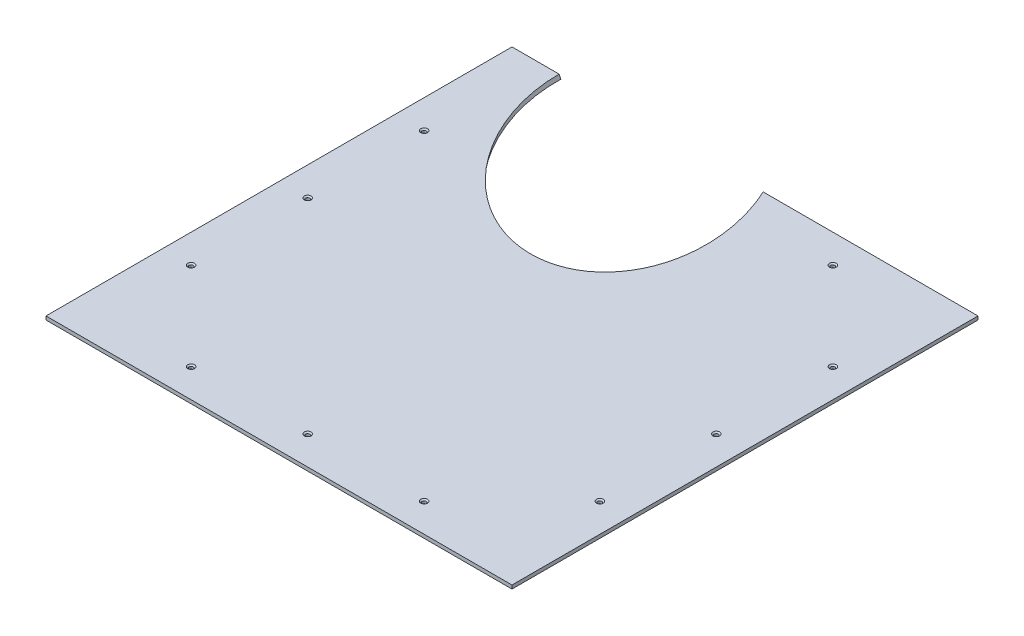
ISO-10303-21;
HEADER;
FILE_DESCRIPTION(('STEP AP214'),'2;1');
FILE_NAME('part.step','',(''),(''),'','','');
FILE_SCHEMA(('AUTOMOTIVE_DESIGN { 1 0 10303 214 1 1 1 1 }'));
ENDSEC;
DATA;
#1=APPLICATION_CONTEXT('core data for automotive mechanical design processes');
#2=APPLICATION_PROTOCOL_DEFINITION('international standard','automotive_design',2000,#1);
#3=PRODUCT_CONTEXT('',#1,'mechanical');
#4=PRODUCT('Part','Part','',(#3));
#5=PRODUCT_RELATED_PRODUCT_CATEGORY('part','',(#4));
#6=PRODUCT_DEFINITION_FORMATION('','',#4);
#7=PRODUCT_DEFINITION_CONTEXT('part definition',#1,'design');
#8=PRODUCT_DEFINITION('design','',#6,#7);
#9=PRODUCT_DEFINITION_SHAPE('','',#8);
#10=(LENGTH_UNIT() NAMED_UNIT(*) SI_UNIT(.MILLI.,.METRE.));
#11=(NAMED_UNIT(*) PLANE_ANGLE_UNIT() SI_UNIT($,.RADIAN.));
#12=(NAMED_UNIT(*) SI_UNIT($,.STERADIAN.) SOLID_ANGLE_UNIT());
#13=UNCERTAINTY_MEASURE_WITH_UNIT(LENGTH_MEASURE(1.E-05),#10,'distance_accuracy_value','');
#14=(GEOMETRIC_REPRESENTATION_CONTEXT(3) GLOBAL_UNCERTAINTY_ASSIGNED_CONTEXT((#13)) GLOBAL_UNIT_ASSIGNED_CONTEXT((#10,
#11,#12)) REPRESENTATION_CONTEXT('',''));
#15=CARTESIAN_POINT('',(0.,0.,0.));
#16=DIRECTION('',(0.,0.,1.));
#17=DIRECTION('',(1.,0.,0.));
#18=AXIS2_PLACEMENT_3D('',#15,#16,#17);
#19=CARTESIAN_POINT('',(103.375714,114.488214,-103.375714));
#20=DIRECTION('',(0.,0.,-1.));
#21=DIRECTION('',(1.,0.,0.));
#22=AXIS2_PLACEMENT_3D('',#19,#20,#21);
#23=PLANE('',#22);
#24=CARTESIAN_POINT('',(-42.299006554058,133.507185549891,-103.375714));
#25=DIRECTION('',(0.,0.,-1.));
#26=DIRECTION('',(-0.424776533342625,0.905298236340612,0.));
#27=AXIS2_PLACEMENT_3D('',#24,#25,#26);
#28=ELLIPSE('',#27,71.875734671484,44.45);
#29=CARTESIAN_POINT('',(8.04269529949253,114.488214,-103.375714));
#30=VERTEX_POINT('',#29);
#31=CARTESIAN_POINT('',(8.1290777304634,112.900714,-103.375714));
#32=VERTEX_POINT('',#31);
#33=EDGE_CURVE('E47',#30,#32,#28,.T.);
#34=ORIENTED_EDGE('',*,*,#33,.F.);
#35=DIRECTION('',(1.,0.,0.));
#36=VECTOR('',#35,1.);
#37=CARTESIAN_POINT('',(103.375714,114.488214,-103.375714));
#38=LINE('',#37,#36);
#39=CARTESIAN_POINT('',(103.375714,114.488214,-103.375714));
#40=VERTEX_POINT('',#39);
#41=EDGE_CURVE('E54',#30,#40,#38,.T.);
#42=ORIENTED_EDGE('',*,*,#41,.T.);
#43=DIRECTION('',(0.,-1.,0.));
#44=VECTOR('',#43,1.);
#45=CARTESIAN_POINT('',(103.375714,114.488214,-103.375714));
#46=LINE('',#45,#44);
#47=CARTESIAN_POINT('',(103.375714,112.900714,-103.375714));
#48=VERTEX_POINT('',#47);
#49=EDGE_CURVE('E40',#40,#48,#46,.T.);
#50=ORIENTED_EDGE('',*,*,#49,.T.);
#51=DIRECTION('',(1.,0.,0.));
#52=VECTOR('',#51,1.);
#53=CARTESIAN_POINT('',(103.375714,112.900714,-103.375714));
#54=LINE('',#53,#52);
#55=EDGE_CURVE('E76',#32,#48,#54,.T.);
#56=ORIENTED_EDGE('',*,*,#55,.F.);
#57=EDGE_LOOP('',(#34,#42,#50,#56));
#58=FACE_BOUND('',#57,.T.);
#59=ADVANCED_FACE('F32',(#58),#23,.T.);
#60=CARTESIAN_POINT('',(103.375714,114.488214,103.375714));
#61=DIRECTION('',(1.,0.,0.));
#62=DIRECTION('',(0.,0.,1.));
#63=AXIS2_PLACEMENT_3D('',#60,#61,#62);
#64=PLANE('',#63);
#65=DIRECTION('',(0.,0.,1.));
#66=VECTOR('',#65,1.);
#67=CARTESIAN_POINT('',(103.375714,112.900714,103.375714));
#68=LINE('',#67,#66);
#69=CARTESIAN_POINT('',(103.375714,112.900714,103.375714));
#70=VERTEX_POINT('',#69);
#71=EDGE_CURVE('E128',#48,#70,#68,.T.);
#72=ORIENTED_EDGE('',*,*,#71,.F.);
#73=ORIENTED_EDGE('',*,*,#49,.F.);
#74=DIRECTION('',(0.,0.,1.));
#75=VECTOR('',#74,1.);
#76=CARTESIAN_POINT('',(103.375714,114.488214,103.375714));
#77=LINE('',#76,#75);
#78=CARTESIAN_POINT('',(103.375714,114.488214,103.375714));
#79=VERTEX_POINT('',#78);
#80=EDGE_CURVE('E109',#40,#79,#77,.T.);
#81=ORIENTED_EDGE('',*,*,#80,.T.);
#82=DIRECTION('',(0.,-1.,0.));
#83=VECTOR('',#82,1.);
#84=CARTESIAN_POINT('',(103.375714,114.488214,103.375714));
#85=LINE('',#84,#83);
#86=EDGE_CURVE('E82',#79,#70,#85,.T.);
#87=ORIENTED_EDGE('',*,*,#86,.T.);
#88=EDGE_LOOP('',(#72,#73,#81,#87));
#89=FACE_BOUND('',#88,.T.);
#90=ADVANCED_FACE('F34',(#89),#64,.T.);
#91=CARTESIAN_POINT('',(-81.712656524695,112.900714,-103.375714));
#92=VERTEX_POINT('',#91);
#93=CARTESIAN_POINT('',(-82.4748140502596,114.488214,-103.375714));
#94=VERTEX_POINT('',#93);
#95=EDGE_CURVE('E93',#92,#94,#28,.T.);
#96=ORIENTED_EDGE('',*,*,#95,.F.);
#97=CARTESIAN_POINT('',(-103.375714,112.900714,-103.375714));
#98=VERTEX_POINT('',#97);
#99=EDGE_CURVE('E100',#98,#92,#54,.T.);
#100=ORIENTED_EDGE('',*,*,#99,.F.);
#101=DIRECTION('',(0.,-1.,0.));
#102=VECTOR('',#101,1.);
#103=CARTESIAN_POINT('',(-103.375714,114.488214,-103.375714));
#104=LINE('',#103,#102);
#105=CARTESIAN_POINT('',(-103.375714,114.488214,-103.375714));
#106=VERTEX_POINT('',#105);
#107=EDGE_CURVE('E118',#106,#98,#104,.T.);
#108=ORIENTED_EDGE('',*,*,#107,.F.);
#109=EDGE_CURVE('E102',#106,#94,#38,.T.);
#110=ORIENTED_EDGE('',*,*,#109,.T.);
#111=EDGE_LOOP('',(#96,#100,#108,#110));
#112=FACE_BOUND('',#111,.T.);
#113=ADVANCED_FACE('F99',(#112),#23,.T.);
#114=CARTESIAN_POINT('',(-103.375714,114.488214,103.375714));
#115=DIRECTION('',(-1.,0.,0.));
#116=DIRECTION('',(0.,0.,-1.));
#117=AXIS2_PLACEMENT_3D('',#114,#115,#116);
#118=PLANE('',#117);
#119=DIRECTION('',(0.,0.,-1.));
#120=VECTOR('',#119,1.);
#121=CARTESIAN_POINT('',(-103.375714,112.900714,103.375714));
#122=LINE('',#121,#120);
#123=CARTESIAN_POINT('',(-103.375714,112.900714,103.375714));
#124=VERTEX_POINT('',#123);
#125=EDGE_CURVE('E108',#124,#98,#122,.T.);
#126=ORIENTED_EDGE('',*,*,#125,.F.);
#127=DIRECTION('',(0.,-1.,0.));
#128=VECTOR('',#127,1.);
#129=CARTESIAN_POINT('',(-103.375714,114.488214,103.375714));
#130=LINE('',#129,#128);
#131=CARTESIAN_POINT('',(-103.375714,114.488214,103.375714));
#132=VERTEX_POINT('',#131);
#133=EDGE_CURVE('E120',#132,#124,#130,.T.);
#134=ORIENTED_EDGE('',*,*,#133,.F.);
#135=DIRECTION('',(0.,0.,-1.));
#136=VECTOR('',#135,1.);
#137=CARTESIAN_POINT('',(-103.375714,114.488214,103.375714));
#138=LINE('',#137,#136);
#139=EDGE_CURVE('E124',#132,#106,#138,.T.);
#140=ORIENTED_EDGE('',*,*,#139,.T.);
#141=ORIENTED_EDGE('',*,*,#107,.T.);
#142=EDGE_LOOP('',(#126,#134,#140,#141));
#143=FACE_BOUND('',#142,.T.);
#144=ADVANCED_FACE('F135',(#143),#118,.T.);
#145=CARTESIAN_POINT('',(103.375714,114.488214,103.375714));
#146=DIRECTION('',(0.,0.,1.));
#147=DIRECTION('',(-1.,0.,0.));
#148=AXIS2_PLACEMENT_3D('',#145,#146,#147);
#149=PLANE('',#148);
#150=DIRECTION('',(-1.,0.,0.));
#151=VECTOR('',#150,1.);
#152=CARTESIAN_POINT('',(103.375714,112.900714,103.375714));
#153=LINE('',#152,#151);
#154=EDGE_CURVE('E129',#70,#124,#153,.T.);
#155=ORIENTED_EDGE('',*,*,#154,.F.);
#156=ORIENTED_EDGE('',*,*,#86,.F.);
#157=DIRECTION('',(-1.,0.,0.));
#158=VECTOR('',#157,1.);
#159=CARTESIAN_POINT('',(103.375714,114.488214,103.375714));
#160=LINE('',#159,#158);
#161=EDGE_CURVE('E112',#79,#132,#160,.T.);
#162=ORIENTED_EDGE('',*,*,#161,.T.);
#163=ORIENTED_EDGE('',*,*,#133,.T.);
#164=EDGE_LOOP('',(#155,#156,#162,#163));
#165=FACE_BOUND('',#164,.T.);
#166=ADVANCED_FACE('F131',(#165),#149,.T.);
#167=CARTESIAN_POINT('',(103.375714,114.488214,-103.375714));
#168=DIRECTION('',(0.,1.,0.));
#169=DIRECTION('',(0.,0.,-1.));
#170=AXIS2_PLACEMENT_3D('',#167,#168,#169);
#171=PLANE('',#170);
#172=CARTESIAN_POINT('',(-33.3750823946994,114.488214,-86.8427742647757));
#173=DIRECTION('',(0.,1.,0.));
#174=DIRECTION('',(-0.474989701314118,0.,-0.879991354301578));
#175=AXIS2_PLACEMENT_3D('',#172,#173,#174);
#176=ELLIPSE('',#175,62.480622920719,44.45);
#177=EDGE_CURVE('E139',#94,#30,#176,.T.);
#178=ORIENTED_EDGE('',*,*,#177,.F.);
#179=ORIENTED_EDGE('',*,*,#109,.F.);
#180=ORIENTED_EDGE('',*,*,#139,.F.);
#181=ORIENTED_EDGE('',*,*,#161,.F.);
#182=ORIENTED_EDGE('',*,*,#80,.F.);
#183=ORIENTED_EDGE('',*,*,#41,.F.);
#184=EDGE_LOOP('',(#178,#179,#180,#181,#182,#183));
#185=FACE_BOUND('',#184,.T.);
#186=CARTESIAN_POINT('',(-90.6757140000005,114.488214,51.6878569999991));
#187=DIRECTION('',(0.,1.,0.));
#188=DIRECTION('',(0.,0.,-1.));
#189=AXIS2_PLACEMENT_3D('',#186,#187,#188);
#190=CIRCLE('',#189,1.51130000000001);
#191=CARTESIAN_POINT('',(-90.6757140000005,114.488214,50.1765569999991));
#192=VERTEX_POINT('',#191);
#193=EDGE_CURVE('E141',#192,#192,#190,.T.);
#194=ORIENTED_EDGE('',*,*,#193,.F.);
#195=EDGE_LOOP('',(#194));
#196=FACE_BOUND('',#195,.T.);
#197=CARTESIAN_POINT('',(-90.675714,114.488214,-9.36190769008373E-13));
#198=DIRECTION('',(0.,1.,0.));
#199=DIRECTION('',(0.,0.,-1.));
#200=AXIS2_PLACEMENT_3D('',#197,#198,#199);
#201=CIRCLE('',#200,1.51129999999999);
#202=CARTESIAN_POINT('',(-90.675714,114.488214,-1.51130000000093));
#203=VERTEX_POINT('',#202);
#204=EDGE_CURVE('E152',#203,#203,#201,.T.);
#205=ORIENTED_EDGE('',*,*,#204,.F.);
#206=EDGE_LOOP('',(#205));
#207=FACE_BOUND('',#206,.T.);
#208=CARTESIAN_POINT('',(-90.6757139999995,114.488214,-51.687857000001));
#209=DIRECTION('',(0.,1.,0.));
#210=DIRECTION('',(0.,0.,-1.));
#211=AXIS2_PLACEMENT_3D('',#208,#209,#210);
#212=CIRCLE('',#211,1.51129999999999);
#213=CARTESIAN_POINT('',(-90.6757139999995,114.488214,-53.1991570000009));
#214=VERTEX_POINT('',#213);
#215=EDGE_CURVE('E161',#214,#214,#212,.T.);
#216=ORIENTED_EDGE('',*,*,#215,.F.);
#217=EDGE_LOOP('',(#216));
#218=FACE_BOUND('',#217,.T.);
#219=CARTESIAN_POINT('',(51.6878569999994,114.488214,90.6757140000004));
#220=DIRECTION('',(0.,1.,0.));
#221=DIRECTION('',(0.,0.,-1.));
#222=AXIS2_PLACEMENT_3D('',#219,#220,#221);
#223=CIRCLE('',#222,1.5113);
#224=CARTESIAN_POINT('',(51.6878569999994,114.488214,89.1644140000004));
#225=VERTEX_POINT('',#224);
#226=EDGE_CURVE('E170',#225,#225,#223,.T.);
#227=ORIENTED_EDGE('',*,*,#226,.F.);
#228=EDGE_LOOP('',(#227));
#229=FACE_BOUND('',#228,.T.);
#230=CARTESIAN_POINT('',(-6.1959802232066E-13,114.488214,90.675714));
#231=DIRECTION('',(0.,1.,0.));
#232=DIRECTION('',(0.,0.,-1.));
#233=AXIS2_PLACEMENT_3D('',#230,#231,#232);
#234=CIRCLE('',#233,1.5113);
#235=CARTESIAN_POINT('',(-6.1959802232066E-13,114.488214,89.164414));
#236=VERTEX_POINT('',#235);
#237=EDGE_CURVE('E179',#236,#236,#234,.T.);
#238=ORIENTED_EDGE('',*,*,#237,.F.);
#239=EDGE_LOOP('',(#238));
#240=FACE_BOUND('',#239,.T.);
#241=CARTESIAN_POINT('',(-51.6878570000006,114.488214,90.6757139999997));
#242=DIRECTION('',(0.,1.,0.));
#243=DIRECTION('',(0.,0.,-1.));
#244=AXIS2_PLACEMENT_3D('',#241,#242,#243);
#245=CIRCLE('',#244,1.5113);
#246=CARTESIAN_POINT('',(-51.6878570000006,114.488214,89.1644139999997));
#247=VERTEX_POINT('',#246);
#248=EDGE_CURVE('E188',#247,#247,#245,.T.);
#249=ORIENTED_EDGE('',*,*,#248,.F.);
#250=EDGE_LOOP('',(#249));
#251=FACE_BOUND('',#250,.T.);
#252=CARTESIAN_POINT('',(90.6757140000002,114.488214,-51.6878569999997));
#253=DIRECTION('',(0.,1.,0.));
#254=DIRECTION('',(0.,0.,-1.));
#255=AXIS2_PLACEMENT_3D('',#252,#253,#254);
#256=CIRCLE('',#255,1.51130000000001);
#257=CARTESIAN_POINT('',(90.6757140000002,114.488214,-53.1991569999997));
#258=VERTEX_POINT('',#257);
#259=EDGE_CURVE('E197',#258,#258,#256,.T.);
#260=ORIENTED_EDGE('',*,*,#259,.F.);
#261=EDGE_LOOP('',(#260));
#262=FACE_BOUND('',#261,.T.);
#263=CARTESIAN_POINT('',(90.675714,114.488214,3.03005275632947E-13));
#264=DIRECTION('',(0.,1.,0.));
#265=DIRECTION('',(0.,0.,-1.));
#266=AXIS2_PLACEMENT_3D('',#263,#264,#265);
#267=CIRCLE('',#266,1.51129999999999);
#268=CARTESIAN_POINT('',(90.675714,114.488214,-1.51129999999969));
#269=VERTEX_POINT('',#268);
#270=EDGE_CURVE('E206',#269,#269,#267,.T.);
#271=ORIENTED_EDGE('',*,*,#270,.F.);
#272=EDGE_LOOP('',(#271));
#273=FACE_BOUND('',#272,.T.);
#274=CARTESIAN_POINT('',(90.6757139999998,114.488214,51.6878570000003));
#275=DIRECTION('',(0.,1.,0.));
#276=DIRECTION('',(0.,0.,-1.));
#277=AXIS2_PLACEMENT_3D('',#274,#275,#276);
#278=CIRCLE('',#277,1.51129999999999);
#279=CARTESIAN_POINT('',(90.6757139999998,114.488214,50.1765570000003));
#280=VERTEX_POINT('',#279);
#281=EDGE_CURVE('E215',#280,#280,#278,.T.);
#282=ORIENTED_EDGE('',*,*,#281,.F.);
#283=EDGE_LOOP('',(#282));
#284=FACE_BOUND('',#283,.T.);
#285=CARTESIAN_POINT('',(51.687857,114.488214,-90.675714));
#286=DIRECTION('',(0.,1.,0.));
#287=DIRECTION('',(0.,0.,-1.));
#288=AXIS2_PLACEMENT_3D('',#285,#286,#287);
#289=CIRCLE('',#288,1.5113);
#290=CARTESIAN_POINT('',(51.687857,114.488214,-92.187014));
#291=VERTEX_POINT('',#290);
#292=EDGE_CURVE('E224',#291,#291,#289,.T.);
#293=ORIENTED_EDGE('',*,*,#292,.F.);
#294=EDGE_LOOP('',(#293));
#295=FACE_BOUND('',#294,.T.);
#296=ADVANCED_FACE('F137',(#185,#196,#207,#218,#229,#240,#251,#262,#273,#284,#295),#171,.T.);
#297=CARTESIAN_POINT('',(103.375714,112.900714,-103.375714));
#298=DIRECTION('',(0.,1.,0.));
#299=DIRECTION('',(0.,0.,-1.));
#300=AXIS2_PLACEMENT_3D('',#297,#298,#299);
#301=PLANE('',#300);
#302=CARTESIAN_POINT('',(-90.6757140000005,112.900714,51.6878569999991));
#303=DIRECTION('',(0.,1.,0.));
#304=DIRECTION('',(0.,0.,-1.));
#305=AXIS2_PLACEMENT_3D('',#302,#303,#304);
#306=CIRCLE('',#305,0.889000000000001);
#307=CARTESIAN_POINT('',(-90.6757140000005,112.900714,50.7988569999991));
#308=VERTEX_POINT('',#307);
#309=EDGE_CURVE('E149',#308,#308,#306,.T.);
#310=ORIENTED_EDGE('',*,*,#309,.T.);
#311=EDGE_LOOP('',(#310));
#312=FACE_BOUND('',#311,.T.);
#313=CARTESIAN_POINT('',(-90.675714,112.900714,-9.36190769008373E-13));
#314=DIRECTION('',(0.,1.,0.));
#315=DIRECTION('',(0.,0.,-1.));
#316=AXIS2_PLACEMENT_3D('',#313,#314,#315);
#317=CIRCLE('',#316,0.889000000000001);
#318=CARTESIAN_POINT('',(-90.675714,112.900714,-0.889000000000937));
#319=VERTEX_POINT('',#318);
#320=EDGE_CURVE('E158',#319,#319,#317,.T.);
#321=ORIENTED_EDGE('',*,*,#320,.T.);
#322=EDGE_LOOP('',(#321));
#323=FACE_BOUND('',#322,.T.);
#324=CARTESIAN_POINT('',(-90.6757139999995,112.900714,-51.687857000001));
#325=DIRECTION('',(0.,1.,0.));
#326=DIRECTION('',(0.,0.,-1.));
#327=AXIS2_PLACEMENT_3D('',#324,#325,#326);
#328=CIRCLE('',#327,0.889000000000001);
#329=CARTESIAN_POINT('',(-90.6757139999995,112.900714,-52.576857000001));
#330=VERTEX_POINT('',#329);
#331=EDGE_CURVE('E167',#330,#330,#328,.T.);
#332=ORIENTED_EDGE('',*,*,#331,.T.);
#333=EDGE_LOOP('',(#332));
#334=FACE_BOUND('',#333,.T.);
#335=CARTESIAN_POINT('',(51.6878569999994,112.900714,90.6757140000004));
#336=DIRECTION('',(0.,1.,0.));
#337=DIRECTION('',(0.,0.,-1.));
#338=AXIS2_PLACEMENT_3D('',#335,#336,#337);
#339=CIRCLE('',#338,0.889000000000001);
#340=CARTESIAN_POINT('',(51.6878569999994,112.900714,89.7867140000004));
#341=VERTEX_POINT('',#340);
#342=EDGE_CURVE('E176',#341,#341,#339,.T.);
#343=ORIENTED_EDGE('',*,*,#342,.T.);
#344=EDGE_LOOP('',(#343));
#345=FACE_BOUND('',#344,.T.);
#346=CARTESIAN_POINT('',(-6.1959802232066E-13,112.900714,90.675714));
#347=DIRECTION('',(0.,1.,0.));
#348=DIRECTION('',(0.,0.,-1.));
#349=AXIS2_PLACEMENT_3D('',#346,#347,#348);
#350=CIRCLE('',#349,0.889);
#351=CARTESIAN_POINT('',(-6.1959802232066E-13,112.900714,89.786714));
#352=VERTEX_POINT('',#351);
#353=EDGE_CURVE('E185',#352,#352,#350,.T.);
#354=ORIENTED_EDGE('',*,*,#353,.T.);
#355=EDGE_LOOP('',(#354));
#356=FACE_BOUND('',#355,.T.);
#357=CARTESIAN_POINT('',(-51.6878570000006,112.900714,90.6757139999997));
#358=DIRECTION('',(0.,1.,0.));
#359=DIRECTION('',(0.,0.,-1.));
#360=AXIS2_PLACEMENT_3D('',#357,#358,#359);
#361=CIRCLE('',#360,0.889000000000001);
#362=CARTESIAN_POINT('',(-51.6878570000006,112.900714,89.7867139999997));
#363=VERTEX_POINT('',#362);
#364=EDGE_CURVE('E194',#363,#363,#361,.T.);
#365=ORIENTED_EDGE('',*,*,#364,.T.);
#366=EDGE_LOOP('',(#365));
#367=FACE_BOUND('',#366,.T.);
#368=CARTESIAN_POINT('',(90.6757140000002,112.900714,-51.6878569999997));
#369=DIRECTION('',(0.,1.,0.));
#370=DIRECTION('',(0.,0.,-1.));
#371=AXIS2_PLACEMENT_3D('',#368,#369,#370);
#372=CIRCLE('',#371,0.889000000000001);
#373=CARTESIAN_POINT('',(90.6757140000002,112.900714,-52.5768569999997));
#374=VERTEX_POINT('',#373);
#375=EDGE_CURVE('E203',#374,#374,#372,.T.);
#376=ORIENTED_EDGE('',*,*,#375,.T.);
#377=EDGE_LOOP('',(#376));
#378=FACE_BOUND('',#377,.T.);
#379=CARTESIAN_POINT('',(90.675714,112.900714,3.03005275632947E-13));
#380=DIRECTION('',(0.,1.,0.));
#381=DIRECTION('',(0.,0.,-1.));
#382=AXIS2_PLACEMENT_3D('',#379,#380,#381);
#383=CIRCLE('',#382,0.889000000000001);
#384=CARTESIAN_POINT('',(90.675714,112.900714,-0.888999999999698));
#385=VERTEX_POINT('',#384);
#386=EDGE_CURVE('E212',#385,#385,#383,.T.);
#387=ORIENTED_EDGE('',*,*,#386,.T.);
#388=EDGE_LOOP('',(#387));
#389=FACE_BOUND('',#388,.T.);
#390=CARTESIAN_POINT('',(90.6757139999998,112.900714,51.6878570000003));
#391=DIRECTION('',(0.,1.,0.));
#392=DIRECTION('',(0.,0.,-1.));
#393=AXIS2_PLACEMENT_3D('',#390,#391,#392);
#394=CIRCLE('',#393,0.889000000000001);
#395=CARTESIAN_POINT('',(90.6757139999998,112.900714,50.7988570000003));
#396=VERTEX_POINT('',#395);
#397=EDGE_CURVE('E221',#396,#396,#394,.T.);
#398=ORIENTED_EDGE('',*,*,#397,.T.);
#399=EDGE_LOOP('',(#398));
#400=FACE_BOUND('',#399,.T.);
#401=CARTESIAN_POINT('',(51.687857,112.900714,-90.675714));
#402=DIRECTION('',(0.,1.,0.));
#403=DIRECTION('',(0.,0.,-1.));
#404=AXIS2_PLACEMENT_3D('',#401,#402,#403);
#405=CIRCLE('',#404,0.889000000000001);
#406=CARTESIAN_POINT('',(51.687857,112.900714,-91.564714));
#407=VERTEX_POINT('',#406);
#408=EDGE_CURVE('E130',#407,#407,#405,.T.);
#409=ORIENTED_EDGE('',*,*,#408,.T.);
#410=EDGE_LOOP('',(#409));
#411=FACE_BOUND('',#410,.T.);
#412=ORIENTED_EDGE('',*,*,#99,.T.);
#413=CARTESIAN_POINT('',(-32.6302088054088,112.900714,-85.4627815684924));
#414=DIRECTION('',(0.,1.,0.));
#415=DIRECTION('',(-0.474989701314118,0.,-0.879991354301578));
#416=AXIS2_PLACEMENT_3D('',#413,#414,#415);
#417=ELLIPSE('',#416,62.480622920719,44.45);
#418=EDGE_CURVE('E11',#92,#32,#417,.T.);
#419=ORIENTED_EDGE('',*,*,#418,.T.);
#420=ORIENTED_EDGE('',*,*,#55,.T.);
#421=ORIENTED_EDGE('',*,*,#71,.T.);
#422=ORIENTED_EDGE('',*,*,#154,.T.);
#423=ORIENTED_EDGE('',*,*,#125,.T.);
#424=EDGE_LOOP('',(#412,#419,#420,#421,#422,#423));
#425=FACE_BOUND('',#424,.T.);
#426=ADVANCED_FACE('F105',(#312,#323,#334,#345,#356,#367,#378,#389,#400,#411,#425),#301,.F.);
#427=CARTESIAN_POINT('',(51.687857,114.488214,-90.675714));
#428=DIRECTION('',(0.,1.,0.));
#429=DIRECTION('',(0.,0.,-1.));
#430=AXIS2_PLACEMENT_3D('',#427,#428,#429);
#431=CYLINDRICAL_SURFACE('',#430,0.888999999999997);
#432=ORIENTED_EDGE('',*,*,#408,.F.);
#433=EDGE_LOOP('',(#432));
#434=FACE_BOUND('',#433,.T.);
#435=CARTESIAN_POINT('',(51.687857,113.966042299518,-90.675714));
#436=DIRECTION('',(0.,1.,0.));
#437=DIRECTION('',(0.,0.,-1.));
#438=AXIS2_PLACEMENT_3D('',#435,#436,#437);
#439=CIRCLE('',#438,0.888999999999994);
#440=CARTESIAN_POINT('',(51.687857,113.966042299518,-91.564714));
#441=VERTEX_POINT('',#440);
#442=EDGE_CURVE('E227',#441,#441,#439,.T.);
#443=ORIENTED_EDGE('',*,*,#442,.T.);
#444=EDGE_LOOP('',(#443));
#445=FACE_BOUND('',#444,.T.);
#446=ADVANCED_FACE('F234',(#434,#445),#431,.F.);
#447=CARTESIAN_POINT('',(51.687857,114.488214,-90.675714));
#448=DIRECTION('',(0.,1.,0.));
#449=DIRECTION('',(0.,0.,-1.));
#450=AXIS2_PLACEMENT_3D('',#447,#448,#449);
#451=CONICAL_SURFACE('',#450,1.5113,0.872664625997172);
#452=ORIENTED_EDGE('',*,*,#442,.F.);
#453=EDGE_LOOP('',(#452));
#454=FACE_BOUND('',#453,.T.);
#455=ORIENTED_EDGE('',*,*,#292,.T.);
#456=EDGE_LOOP('',(#455));
#457=FACE_BOUND('',#456,.T.);
#458=ADVANCED_FACE('F237',(#454,#457),#451,.F.);
#459=CARTESIAN_POINT('',(90.6757139999998,114.488214,51.6878570000003));
#460=DIRECTION('',(0.,1.,0.));
#461=DIRECTION('',(0.,0.,-1.));
#462=AXIS2_PLACEMENT_3D('',#459,#460,#461);
#463=CYLINDRICAL_SURFACE('',#462,0.889000000000001);
#464=ORIENTED_EDGE('',*,*,#397,.F.);
#465=EDGE_LOOP('',(#464));
#466=FACE_BOUND('',#465,.T.);
#467=CARTESIAN_POINT('',(90.6757139999998,113.966042299518,51.6878570000003));
#468=DIRECTION('',(0.,1.,0.));
#469=DIRECTION('',(0.,0.,-1.));
#470=AXIS2_PLACEMENT_3D('',#467,#468,#469);
#471=CIRCLE('',#470,0.889000000000001);
#472=CARTESIAN_POINT('',(90.6757139999998,113.966042299518,50.7988570000003));
#473=VERTEX_POINT('',#472);
#474=EDGE_CURVE('E218',#473,#473,#471,.T.);
#475=ORIENTED_EDGE('',*,*,#474,.T.);
#476=EDGE_LOOP('',(#475));
#477=FACE_BOUND('',#476,.T.);
#478=ADVANCED_FACE('F243',(#466,#477),#463,.F.);
#479=CARTESIAN_POINT('',(90.6757139999998,114.488214,51.6878570000003));
#480=DIRECTION('',(0.,1.,0.));
#481=DIRECTION('',(0.,0.,-1.));
#482=AXIS2_PLACEMENT_3D('',#479,#480,#481);
#483=CONICAL_SURFACE('',#482,1.51129999999999,0.872664625997161);
#484=ORIENTED_EDGE('',*,*,#474,.F.);
#485=EDGE_LOOP('',(#484));
#486=FACE_BOUND('',#485,.T.);
#487=ORIENTED_EDGE('',*,*,#281,.T.);
#488=EDGE_LOOP('',(#487));
#489=FACE_BOUND('',#488,.T.);
#490=ADVANCED_FACE('F297',(#486,#489),#483,.F.);
#491=CARTESIAN_POINT('',(90.675714,114.488214,3.03005275632947E-13));
#492=DIRECTION('',(0.,1.,0.));
#493=DIRECTION('',(0.,0.,-1.));
#494=AXIS2_PLACEMENT_3D('',#491,#492,#493);
#495=CYLINDRICAL_SURFACE('',#494,0.889000000000001);
#496=ORIENTED_EDGE('',*,*,#386,.F.);
#497=EDGE_LOOP('',(#496));
#498=FACE_BOUND('',#497,.T.);
#499=CARTESIAN_POINT('',(90.675714,113.966042299518,3.03005275632947E-13));
#500=DIRECTION('',(0.,1.,0.));
#501=DIRECTION('',(0.,0.,-1.));
#502=AXIS2_PLACEMENT_3D('',#499,#500,#501);
#503=CIRCLE('',#502,0.889000000000001);
#504=CARTESIAN_POINT('',(90.675714,113.966042299518,-0.888999999999698));
#505=VERTEX_POINT('',#504);
#506=EDGE_CURVE('E209',#505,#505,#503,.T.);
#507=ORIENTED_EDGE('',*,*,#506,.T.);
#508=EDGE_LOOP('',(#507));
#509=FACE_BOUND('',#508,.T.);
#510=ADVANCED_FACE('F307',(#498,#509),#495,.F.);
#511=CARTESIAN_POINT('',(90.675714,114.488214,3.03005275632947E-13));
#512=DIRECTION('',(0.,1.,0.));
#513=DIRECTION('',(0.,0.,-1.));
#514=AXIS2_PLACEMENT_3D('',#511,#512,#513);
#515=CONICAL_SURFACE('',#514,1.51129999999999,0.872664625997161);
#516=ORIENTED_EDGE('',*,*,#506,.F.);
#517=EDGE_LOOP('',(#516));
#518=FACE_BOUND('',#517,.T.);
#519=ORIENTED_EDGE('',*,*,#270,.T.);
#520=EDGE_LOOP('',(#519));
#521=FACE_BOUND('',#520,.T.);
#522=ADVANCED_FACE('F317',(#518,#521),#515,.F.);
#523=CARTESIAN_POINT('',(90.6757140000002,114.488214,-51.6878569999997));
#524=DIRECTION('',(0.,1.,0.));
#525=DIRECTION('',(0.,0.,-1.));
#526=AXIS2_PLACEMENT_3D('',#523,#524,#525);
#527=CYLINDRICAL_SURFACE('',#526,0.889000000000001);
#528=ORIENTED_EDGE('',*,*,#375,.F.);
#529=EDGE_LOOP('',(#528));
#530=FACE_BOUND('',#529,.T.);
#531=CARTESIAN_POINT('',(90.6757140000002,113.966042299518,-51.6878569999997));
#532=DIRECTION('',(0.,1.,0.));
#533=DIRECTION('',(0.,0.,-1.));
#534=AXIS2_PLACEMENT_3D('',#531,#532,#533);
#535=CIRCLE('',#534,0.889000000000001);
#536=CARTESIAN_POINT('',(90.6757140000002,113.966042299518,-52.5768569999997));
#537=VERTEX_POINT('',#536);
#538=EDGE_CURVE('E200',#537,#537,#535,.T.);
#539=ORIENTED_EDGE('',*,*,#538,.T.);
#540=EDGE_LOOP('',(#539));
#541=FACE_BOUND('',#540,.T.);
#542=ADVANCED_FACE('F327',(#530,#541),#527,.F.);
#543=CARTESIAN_POINT('',(90.6757140000002,114.488214,-51.6878569999997));
#544=DIRECTION('',(0.,1.,0.));
#545=DIRECTION('',(0.,0.,-1.));
#546=AXIS2_PLACEMENT_3D('',#543,#544,#545);
#547=CONICAL_SURFACE('',#546,1.51130000000001,0.872664625997172);
#548=ORIENTED_EDGE('',*,*,#538,.F.);
#549=EDGE_LOOP('',(#548));
#550=FACE_BOUND('',#549,.T.);
#551=ORIENTED_EDGE('',*,*,#259,.T.);
#552=EDGE_LOOP('',(#551));
#553=FACE_BOUND('',#552,.T.);
#554=ADVANCED_FACE('F337',(#550,#553),#547,.F.);
#555=CARTESIAN_POINT('',(-51.6878570000006,114.488214,90.6757139999997));
#556=DIRECTION('',(0.,1.,0.));
#557=DIRECTION('',(0.,0.,-1.));
#558=AXIS2_PLACEMENT_3D('',#555,#556,#557);
#559=CYLINDRICAL_SURFACE('',#558,0.888999999999997);
#560=ORIENTED_EDGE('',*,*,#364,.F.);
#561=EDGE_LOOP('',(#560));
#562=FACE_BOUND('',#561,.T.);
#563=CARTESIAN_POINT('',(-51.6878570000006,113.966042299518,90.6757139999997));
#564=DIRECTION('',(0.,1.,0.));
#565=DIRECTION('',(0.,0.,-1.));
#566=AXIS2_PLACEMENT_3D('',#563,#564,#565);
#567=CIRCLE('',#566,0.888999999999994);
#568=CARTESIAN_POINT('',(-51.6878570000006,113.966042299518,89.7867139999997));
#569=VERTEX_POINT('',#568);
#570=EDGE_CURVE('E191',#569,#569,#567,.T.);
#571=ORIENTED_EDGE('',*,*,#570,.T.);
#572=EDGE_LOOP('',(#571));
#573=FACE_BOUND('',#572,.T.);
#574=ADVANCED_FACE('F347',(#562,#573),#559,.F.);
#575=CARTESIAN_POINT('',(-51.6878570000006,114.488214,90.6757139999997));
#576=DIRECTION('',(0.,1.,0.));
#577=DIRECTION('',(0.,0.,-1.));
#578=AXIS2_PLACEMENT_3D('',#575,#576,#577);
#579=CONICAL_SURFACE('',#578,1.5113,0.872664625997172);
#580=ORIENTED_EDGE('',*,*,#570,.F.);
#581=EDGE_LOOP('',(#580));
#582=FACE_BOUND('',#581,.T.);
#583=ORIENTED_EDGE('',*,*,#248,.T.);
#584=EDGE_LOOP('',(#583));
#585=FACE_BOUND('',#584,.T.);
#586=ADVANCED_FACE('F357',(#582,#585),#579,.F.);
#587=CARTESIAN_POINT('',(-6.1959802232066E-13,114.488214,90.675714));
#588=DIRECTION('',(0.,1.,0.));
#589=DIRECTION('',(0.,0.,-1.));
#590=AXIS2_PLACEMENT_3D('',#587,#588,#589);
#591=CYLINDRICAL_SURFACE('',#590,0.888999999999998);
#592=ORIENTED_EDGE('',*,*,#353,.F.);
#593=EDGE_LOOP('',(#592));
#594=FACE_BOUND('',#593,.T.);
#595=CARTESIAN_POINT('',(-6.1959802232066E-13,113.966042299518,90.675714));
#596=DIRECTION('',(0.,1.,0.));
#597=DIRECTION('',(0.,0.,-1.));
#598=AXIS2_PLACEMENT_3D('',#595,#596,#597);
#599=CIRCLE('',#598,0.888999999999997);
#600=CARTESIAN_POINT('',(-6.1959802232066E-13,113.966042299518,89.786714));
#601=VERTEX_POINT('',#600);
#602=EDGE_CURVE('E182',#601,#601,#599,.T.);
#603=ORIENTED_EDGE('',*,*,#602,.T.);
#604=EDGE_LOOP('',(#603));
#605=FACE_BOUND('',#604,.T.);
#606=ADVANCED_FACE('F367',(#594,#605),#591,.F.);
#607=CARTESIAN_POINT('',(-6.1959802232066E-13,114.488214,90.675714));
#608=DIRECTION('',(0.,1.,0.));
#609=DIRECTION('',(0.,0.,-1.));
#610=AXIS2_PLACEMENT_3D('',#607,#608,#609);
#611=CONICAL_SURFACE('',#610,1.5113,0.87266462599717);
#612=ORIENTED_EDGE('',*,*,#602,.F.);
#613=EDGE_LOOP('',(#612));
#614=FACE_BOUND('',#613,.T.);
#615=ORIENTED_EDGE('',*,*,#237,.T.);
#616=EDGE_LOOP('',(#615));
#617=FACE_BOUND('',#616,.T.);
#618=ADVANCED_FACE('F377',(#614,#617),#611,.F.);
#619=CARTESIAN_POINT('',(51.6878569999994,114.488214,90.6757140000004));
#620=DIRECTION('',(0.,1.,0.));
#621=DIRECTION('',(0.,0.,-1.));
#622=AXIS2_PLACEMENT_3D('',#619,#620,#621);
#623=CYLINDRICAL_SURFACE('',#622,0.888999999999997);
#624=ORIENTED_EDGE('',*,*,#342,.F.);
#625=EDGE_LOOP('',(#624));
#626=FACE_BOUND('',#625,.T.);
#627=CARTESIAN_POINT('',(51.6878569999994,113.966042299518,90.6757140000004));
#628=DIRECTION('',(0.,1.,0.));
#629=DIRECTION('',(0.,0.,-1.));
#630=AXIS2_PLACEMENT_3D('',#627,#628,#629);
#631=CIRCLE('',#630,0.888999999999994);
#632=CARTESIAN_POINT('',(51.6878569999994,113.966042299518,89.7867140000004));
#633=VERTEX_POINT('',#632);
#634=EDGE_CURVE('E173',#633,#633,#631,.T.);
#635=ORIENTED_EDGE('',*,*,#634,.T.);
#636=EDGE_LOOP('',(#635));
#637=FACE_BOUND('',#636,.T.);
#638=ADVANCED_FACE('F387',(#626,#637),#623,.F.);
#639=CARTESIAN_POINT('',(51.6878569999994,114.488214,90.6757140000004));
#640=DIRECTION('',(0.,1.,0.));
#641=DIRECTION('',(0.,0.,-1.));
#642=AXIS2_PLACEMENT_3D('',#639,#640,#641);
#643=CONICAL_SURFACE('',#642,1.5113,0.872664625997172);
#644=ORIENTED_EDGE('',*,*,#634,.F.);
#645=EDGE_LOOP('',(#644));
#646=FACE_BOUND('',#645,.T.);
#647=ORIENTED_EDGE('',*,*,#226,.T.);
#648=EDGE_LOOP('',(#647));
#649=FACE_BOUND('',#648,.T.);
#650=ADVANCED_FACE('F397',(#646,#649),#643,.F.);
#651=CARTESIAN_POINT('',(-90.6757139999995,114.488214,-51.687857000001));
#652=DIRECTION('',(0.,1.,0.));
#653=DIRECTION('',(0.,0.,-1.));
#654=AXIS2_PLACEMENT_3D('',#651,#652,#653);
#655=CYLINDRICAL_SURFACE('',#654,0.889000000000001);
#656=ORIENTED_EDGE('',*,*,#331,.F.);
#657=EDGE_LOOP('',(#656));
#658=FACE_BOUND('',#657,.T.);
#659=CARTESIAN_POINT('',(-90.6757139999995,113.966042299518,-51.687857000001));
#660=DIRECTION('',(0.,1.,0.));
#661=DIRECTION('',(0.,0.,-1.));
#662=AXIS2_PLACEMENT_3D('',#659,#660,#661);
#663=CIRCLE('',#662,0.889000000000001);
#664=CARTESIAN_POINT('',(-90.6757139999995,113.966042299518,-52.576857000001));
#665=VERTEX_POINT('',#664);
#666=EDGE_CURVE('E164',#665,#665,#663,.T.);
#667=ORIENTED_EDGE('',*,*,#666,.T.);
#668=EDGE_LOOP('',(#667));
#669=FACE_BOUND('',#668,.T.);
#670=ADVANCED_FACE('F407',(#658,#669),#655,.F.);
#671=CARTESIAN_POINT('',(-90.6757139999995,114.488214,-51.687857000001));
#672=DIRECTION('',(0.,1.,0.));
#673=DIRECTION('',(0.,0.,-1.));
#674=AXIS2_PLACEMENT_3D('',#671,#672,#673);
#675=CONICAL_SURFACE('',#674,1.51129999999999,0.872664625997161);
#676=ORIENTED_EDGE('',*,*,#666,.F.);
#677=EDGE_LOOP('',(#676));
#678=FACE_BOUND('',#677,.T.);
#679=ORIENTED_EDGE('',*,*,#215,.T.);
#680=EDGE_LOOP('',(#679));
#681=FACE_BOUND('',#680,.T.);
#682=ADVANCED_FACE('F417',(#678,#681),#675,.F.);
#683=CARTESIAN_POINT('',(-90.675714,114.488214,-9.36190769008373E-13));
#684=DIRECTION('',(0.,1.,0.));
#685=DIRECTION('',(0.,0.,-1.));
#686=AXIS2_PLACEMENT_3D('',#683,#684,#685);
#687=CYLINDRICAL_SURFACE('',#686,0.889000000000001);
#688=ORIENTED_EDGE('',*,*,#320,.F.);
#689=EDGE_LOOP('',(#688));
#690=FACE_BOUND('',#689,.T.);
#691=CARTESIAN_POINT('',(-90.675714,113.966042299518,-9.36190769008373E-13));
#692=DIRECTION('',(0.,1.,0.));
#693=DIRECTION('',(0.,0.,-1.));
#694=AXIS2_PLACEMENT_3D('',#691,#692,#693);
#695=CIRCLE('',#694,0.889000000000001);
#696=CARTESIAN_POINT('',(-90.675714,113.966042299518,-0.889000000000937));
#697=VERTEX_POINT('',#696);
#698=EDGE_CURVE('E155',#697,#697,#695,.T.);
#699=ORIENTED_EDGE('',*,*,#698,.T.);
#700=EDGE_LOOP('',(#699));
#701=FACE_BOUND('',#700,.T.);
#702=ADVANCED_FACE('F427',(#690,#701),#687,.F.);
#703=CARTESIAN_POINT('',(-90.675714,114.488214,-9.36190769008373E-13));
#704=DIRECTION('',(0.,1.,0.));
#705=DIRECTION('',(0.,0.,-1.));
#706=AXIS2_PLACEMENT_3D('',#703,#704,#705);
#707=CONICAL_SURFACE('',#706,1.51129999999999,0.872664625997161);
#708=ORIENTED_EDGE('',*,*,#698,.F.);
#709=EDGE_LOOP('',(#708));
#710=FACE_BOUND('',#709,.T.);
#711=ORIENTED_EDGE('',*,*,#204,.T.);
#712=EDGE_LOOP('',(#711));
#713=FACE_BOUND('',#712,.T.);
#714=ADVANCED_FACE('F437',(#710,#713),#707,.F.);
#715=CARTESIAN_POINT('',(-90.6757140000005,114.488214,51.6878569999991));
#716=DIRECTION('',(0.,1.,0.));
#717=DIRECTION('',(0.,0.,-1.));
#718=AXIS2_PLACEMENT_3D('',#715,#716,#717);
#719=CYLINDRICAL_SURFACE('',#718,0.889000000000001);
#720=ORIENTED_EDGE('',*,*,#309,.F.);
#721=EDGE_LOOP('',(#720));
#722=FACE_BOUND('',#721,.T.);
#723=CARTESIAN_POINT('',(-90.6757140000005,113.966042299518,51.6878569999991));
#724=DIRECTION('',(0.,1.,0.));
#725=DIRECTION('',(0.,0.,-1.));
#726=AXIS2_PLACEMENT_3D('',#723,#724,#725);
#727=CIRCLE('',#726,0.889000000000001);
#728=CARTESIAN_POINT('',(-90.6757140000005,113.966042299518,50.7988569999991));
#729=VERTEX_POINT('',#728);
#730=EDGE_CURVE('E144',#729,#729,#727,.T.);
#731=ORIENTED_EDGE('',*,*,#730,.T.);
#732=EDGE_LOOP('',(#731));
#733=FACE_BOUND('',#732,.T.);
#734=ADVANCED_FACE('F447',(#722,#733),#719,.F.);
#735=CARTESIAN_POINT('',(-90.6757140000005,114.488214,51.6878569999991));
#736=DIRECTION('',(0.,1.,0.));
#737=DIRECTION('',(0.,0.,-1.));
#738=AXIS2_PLACEMENT_3D('',#735,#736,#737);
#739=CONICAL_SURFACE('',#738,1.51130000000001,0.872664625997172);
#740=ORIENTED_EDGE('',*,*,#730,.F.);
#741=EDGE_LOOP('',(#740));
#742=FACE_BOUND('',#741,.T.);
#743=ORIENTED_EDGE('',*,*,#193,.T.);
#744=EDGE_LOOP('',(#743));
#745=FACE_BOUND('',#744,.T.);
#746=ADVANCED_FACE('F457',(#742,#745),#739,.F.);
#747=CARTESIAN_POINT('',(21.5075256836708,-2.47947229882256,14.8356841878396));
#748=DIRECTION('',(-0.333806859233772,0.711420564042746,-0.618428461332099));
#749=DIRECTION('',(0.,0.656059028990507,0.754709580222772));
#750=AXIS2_PLACEMENT_3D('',#747,#748,#749);
#751=CYLINDRICAL_SURFACE('',#750,44.45);
#752=ORIENTED_EDGE('',*,*,#177,.T.);
#753=ORIENTED_EDGE('',*,*,#33,.T.);
#754=ORIENTED_EDGE('',*,*,#418,.F.);
#755=ORIENTED_EDGE('',*,*,#95,.T.);
#756=EDGE_LOOP('',(#752,#753,#754,#755));
#757=FACE_BOUND('',#756,.T.);
#758=ADVANCED_FACE('F92',(#757),#751,.F.);
#759=CLOSED_SHELL('',(#59,#90,#113,#144,#166,#296,#426,#446,#458,#478,#490,#510,#522,#542,#554,
#574,#586,#606,#618,#638,#650,#670,#682,#702,#714,#734,#746,#758));
#760=MANIFOLD_SOLID_BREP('B2',#759);
#761=ADVANCED_BREP_SHAPE_REPRESENTATION('',(#18,#760),#14);
#762=SHAPE_DEFINITION_REPRESENTATION(#9,#761);
ENDSEC;
END-ISO-10303-21;
